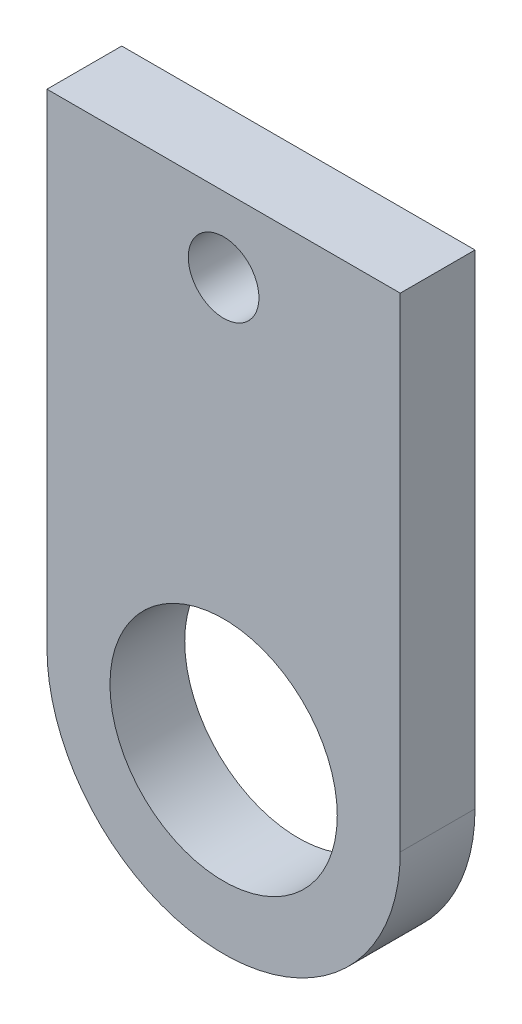
ISO-10303-21;
HEADER;
FILE_DESCRIPTION(('STEP AP214'),'2;1');
FILE_NAME('part.step','',(''),(''),'','','');
FILE_SCHEMA(('AUTOMOTIVE_DESIGN { 1 0 10303 214 1 1 1 1 }'));
ENDSEC;
DATA;
#1=APPLICATION_CONTEXT('core data for automotive mechanical design processes');
#2=APPLICATION_PROTOCOL_DEFINITION('international standard','automotive_design',2000,#1);
#3=PRODUCT_CONTEXT('',#1,'mechanical');
#4=PRODUCT('Part','Part','',(#3));
#5=PRODUCT_RELATED_PRODUCT_CATEGORY('part','',(#4));
#6=PRODUCT_DEFINITION_FORMATION('','',#4);
#7=PRODUCT_DEFINITION_CONTEXT('part definition',#1,'design');
#8=PRODUCT_DEFINITION('design','',#6,#7);
#9=PRODUCT_DEFINITION_SHAPE('','',#8);
#10=(LENGTH_UNIT() NAMED_UNIT(*) SI_UNIT(.MILLI.,.METRE.));
#11=(NAMED_UNIT(*) PLANE_ANGLE_UNIT() SI_UNIT($,.RADIAN.));
#12=(NAMED_UNIT(*) SI_UNIT($,.STERADIAN.) SOLID_ANGLE_UNIT());
#13=UNCERTAINTY_MEASURE_WITH_UNIT(LENGTH_MEASURE(1.E-05),#10,'distance_accuracy_value','');
#14=(GEOMETRIC_REPRESENTATION_CONTEXT(3) GLOBAL_UNCERTAINTY_ASSIGNED_CONTEXT((#13)) GLOBAL_UNIT_ASSIGNED_CONTEXT((#10,
#11,#12)) REPRESENTATION_CONTEXT('',''));
#15=CARTESIAN_POINT('',(0.,0.,0.));
#16=DIRECTION('',(0.,0.,1.));
#17=DIRECTION('',(1.,0.,0.));
#18=AXIS2_PLACEMENT_3D('',#15,#16,#17);
#19=CARTESIAN_POINT('',(-61.8354664257483,6.61926757469637,3.175));
#20=DIRECTION('',(0.,0.,1.));
#21=DIRECTION('',(1.,0.,0.));
#22=AXIS2_PLACEMENT_3D('',#19,#20,#21);
#23=PLANE('',#22);
#24=CARTESIAN_POINT('',(-61.8354664257483,6.61926757469637,3.175));
#25=DIRECTION('',(0.,0.,1.));
#26=DIRECTION('',(1.,0.,0.));
#27=AXIS2_PLACEMENT_3D('',#24,#25,#26);
#28=CIRCLE('',#27,4.826);
#29=CARTESIAN_POINT('',(-57.0094664257483,6.61926757469637,3.175));
#30=VERTEX_POINT('',#29);
#31=EDGE_CURVE('E100',#30,#30,#28,.T.);
#32=ORIENTED_EDGE('',*,*,#31,.F.);
#33=EDGE_LOOP('',(#32));
#34=FACE_BOUND('',#33,.T.);
#35=DIRECTION('',(0.,-1.,0.));
#36=VECTOR('',#35,1.);
#37=CARTESIAN_POINT('',(-69.3354664257483,27.1692675746964,3.175));
#38=LINE('',#37,#36);
#39=CARTESIAN_POINT('',(-69.3354664257483,27.1692675746964,3.175));
#40=VERTEX_POINT('',#39);
#41=CARTESIAN_POINT('',(-69.3354664257483,6.61926757469637,3.175));
#42=VERTEX_POINT('',#41);
#43=EDGE_CURVE('E85',#40,#42,#38,.T.);
#44=ORIENTED_EDGE('',*,*,#43,.T.);
#45=CARTESIAN_POINT('',(-61.8354664257483,6.61926757469637,3.175));
#46=DIRECTION('',(0.,0.,1.));
#47=DIRECTION('',(1.,0.,0.));
#48=AXIS2_PLACEMENT_3D('',#45,#46,#47);
#49=CIRCLE('',#48,7.5);
#50=CARTESIAN_POINT('',(-54.3354664257483,6.61926757469637,3.175));
#51=VERTEX_POINT('',#50);
#52=EDGE_CURVE('E80',#42,#51,#49,.T.);
#53=ORIENTED_EDGE('',*,*,#52,.T.);
#54=DIRECTION('',(0.,1.,0.));
#55=VECTOR('',#54,1.);
#56=CARTESIAN_POINT('',(-54.3354664257483,27.1692675746964,3.175));
#57=LINE('',#56,#55);
#58=CARTESIAN_POINT('',(-54.3354664257483,27.1692675746964,3.175));
#59=VERTEX_POINT('',#58);
#60=EDGE_CURVE('E83',#51,#59,#57,.T.);
#61=ORIENTED_EDGE('',*,*,#60,.T.);
#62=DIRECTION('',(-1.,0.,0.));
#63=VECTOR('',#62,1.);
#64=CARTESIAN_POINT('',(-69.3354664257483,27.1692675746964,3.175));
#65=LINE('',#64,#63);
#66=EDGE_CURVE('E50',#59,#40,#65,.T.);
#67=ORIENTED_EDGE('',*,*,#66,.T.);
#68=EDGE_LOOP('',(#44,#53,#61,#67));
#69=FACE_BOUND('',#68,.T.);
#70=CARTESIAN_POINT('',(-61.8354664257483,23.9942675746964,3.175));
#71=DIRECTION('',(0.,0.,1.));
#72=DIRECTION('',(1.,0.,0.));
#73=AXIS2_PLACEMENT_3D('',#70,#71,#72);
#74=CIRCLE('',#73,1.5);
#75=CARTESIAN_POINT('',(-60.3354664257483,23.9942675746964,3.175));
#76=VERTEX_POINT('',#75);
#77=EDGE_CURVE('E115',#76,#76,#74,.T.);
#78=ORIENTED_EDGE('',*,*,#77,.F.);
#79=EDGE_LOOP('',(#78));
#80=FACE_BOUND('',#79,.T.);
#81=ADVANCED_FACE('F33',(#34,#69,#80),#23,.T.);
#82=CARTESIAN_POINT('',(-61.8354664257483,6.61926757469637,0.));
#83=DIRECTION('',(0.,0.,1.));
#84=DIRECTION('',(1.,0.,0.));
#85=AXIS2_PLACEMENT_3D('',#82,#83,#84);
#86=PLANE('',#85);
#87=DIRECTION('',(0.,-1.,0.));
#88=VECTOR('',#87,1.);
#89=CARTESIAN_POINT('',(-69.3354664257483,27.1692675746964,0.));
#90=LINE('',#89,#88);
#91=CARTESIAN_POINT('',(-69.3354664257483,27.1692675746964,0.));
#92=VERTEX_POINT('',#91);
#93=CARTESIAN_POINT('',(-69.3354664257483,6.61926757469637,0.));
#94=VERTEX_POINT('',#93);
#95=EDGE_CURVE('E97',#92,#94,#90,.T.);
#96=ORIENTED_EDGE('',*,*,#95,.F.);
#97=DIRECTION('',(-1.,0.,0.));
#98=VECTOR('',#97,1.);
#99=CARTESIAN_POINT('',(-69.3354664257483,27.1692675746964,0.));
#100=LINE('',#99,#98);
#101=CARTESIAN_POINT('',(-54.3354664257483,27.1692675746964,0.));
#102=VERTEX_POINT('',#101);
#103=EDGE_CURVE('E73',#102,#92,#100,.T.);
#104=ORIENTED_EDGE('',*,*,#103,.F.);
#105=DIRECTION('',(0.,1.,0.));
#106=VECTOR('',#105,1.);
#107=CARTESIAN_POINT('',(-54.3354664257483,27.1692675746964,0.));
#108=LINE('',#107,#106);
#109=CARTESIAN_POINT('',(-54.3354664257483,6.61926757469637,0.));
#110=VERTEX_POINT('',#109);
#111=EDGE_CURVE('E67',#110,#102,#108,.T.);
#112=ORIENTED_EDGE('',*,*,#111,.F.);
#113=CARTESIAN_POINT('',(-61.8354664257483,6.61926757469637,0.));
#114=DIRECTION('',(0.,0.,1.));
#115=DIRECTION('',(1.,0.,0.));
#116=AXIS2_PLACEMENT_3D('',#113,#114,#115);
#117=CIRCLE('',#116,7.5);
#118=EDGE_CURVE('E89',#94,#110,#117,.T.);
#119=ORIENTED_EDGE('',*,*,#118,.F.);
#120=EDGE_LOOP('',(#96,#104,#112,#119));
#121=FACE_BOUND('',#120,.T.);
#122=CARTESIAN_POINT('',(-61.8354664257483,6.61926757469637,0.));
#123=DIRECTION('',(0.,0.,1.));
#124=DIRECTION('',(1.,0.,0.));
#125=AXIS2_PLACEMENT_3D('',#122,#123,#124);
#126=CIRCLE('',#125,4.826);
#127=CARTESIAN_POINT('',(-57.0094664257483,6.61926757469637,0.));
#128=VERTEX_POINT('',#127);
#129=EDGE_CURVE('E112',#128,#128,#126,.T.);
#130=ORIENTED_EDGE('',*,*,#129,.T.);
#131=EDGE_LOOP('',(#130));
#132=FACE_BOUND('',#131,.T.);
#133=CARTESIAN_POINT('',(-61.8354664257483,23.9942675746964,0.));
#134=DIRECTION('',(0.,0.,1.));
#135=DIRECTION('',(1.,0.,0.));
#136=AXIS2_PLACEMENT_3D('',#133,#134,#135);
#137=CIRCLE('',#136,1.5);
#138=CARTESIAN_POINT('',(-60.3354664257483,23.9942675746964,0.));
#139=VERTEX_POINT('',#138);
#140=EDGE_CURVE('E118',#139,#139,#137,.T.);
#141=ORIENTED_EDGE('',*,*,#140,.T.);
#142=EDGE_LOOP('',(#141));
#143=FACE_BOUND('',#142,.T.);
#144=ADVANCED_FACE('F108',(#121,#132,#143),#86,.F.);
#145=CARTESIAN_POINT('',(-69.3354664257483,27.1692675746964,3.175));
#146=DIRECTION('',(1.,0.,0.));
#147=DIRECTION('',(0.,1.,0.));
#148=AXIS2_PLACEMENT_3D('',#145,#146,#147);
#149=PLANE('',#148);
#150=ORIENTED_EDGE('',*,*,#95,.T.);
#151=DIRECTION('',(0.,0.,-1.));
#152=VECTOR('',#151,1.);
#153=CARTESIAN_POINT('',(-69.3354664257483,6.61926757469637,3.175));
#154=LINE('',#153,#152);
#155=EDGE_CURVE('E11',#42,#94,#154,.T.);
#156=ORIENTED_EDGE('',*,*,#155,.F.);
#157=ORIENTED_EDGE('',*,*,#43,.F.);
#158=DIRECTION('',(0.,0.,-1.));
#159=VECTOR('',#158,1.);
#160=CARTESIAN_POINT('',(-69.3354664257483,27.1692675746964,3.175));
#161=LINE('',#160,#159);
#162=EDGE_CURVE('E93',#40,#92,#161,.T.);
#163=ORIENTED_EDGE('',*,*,#162,.T.);
#164=EDGE_LOOP('',(#150,#156,#157,#163));
#165=FACE_BOUND('',#164,.T.);
#166=ADVANCED_FACE('F35',(#165),#149,.F.);
#167=CARTESIAN_POINT('',(-61.8354664257483,6.61926757469637,3.175));
#168=DIRECTION('',(0.,0.,-1.));
#169=DIRECTION('',(-1.,0.,0.));
#170=AXIS2_PLACEMENT_3D('',#167,#168,#169);
#171=CYLINDRICAL_SURFACE('',#170,7.5);
#172=ORIENTED_EDGE('',*,*,#118,.T.);
#173=DIRECTION('',(0.,0.,-1.));
#174=VECTOR('',#173,1.);
#175=CARTESIAN_POINT('',(-54.3354664257483,6.61926757469637,3.175));
#176=LINE('',#175,#174);
#177=EDGE_CURVE('E42',#51,#110,#176,.T.);
#178=ORIENTED_EDGE('',*,*,#177,.F.);
#179=ORIENTED_EDGE('',*,*,#52,.F.);
#180=ORIENTED_EDGE('',*,*,#155,.T.);
#181=EDGE_LOOP('',(#172,#178,#179,#180));
#182=FACE_BOUND('',#181,.T.);
#183=ADVANCED_FACE('F88',(#182),#171,.T.);
#184=CARTESIAN_POINT('',(-54.3354664257483,27.1692675746964,3.175));
#185=DIRECTION('',(-1.,0.,0.));
#186=DIRECTION('',(0.,-1.,0.));
#187=AXIS2_PLACEMENT_3D('',#184,#185,#186);
#188=PLANE('',#187);
#189=ORIENTED_EDGE('',*,*,#111,.T.);
#190=DIRECTION('',(0.,0.,-1.));
#191=VECTOR('',#190,1.);
#192=CARTESIAN_POINT('',(-54.3354664257483,27.1692675746964,3.175));
#193=LINE('',#192,#191);
#194=EDGE_CURVE('E90',#59,#102,#193,.T.);
#195=ORIENTED_EDGE('',*,*,#194,.F.);
#196=ORIENTED_EDGE('',*,*,#60,.F.);
#197=ORIENTED_EDGE('',*,*,#177,.T.);
#198=EDGE_LOOP('',(#189,#195,#196,#197));
#199=FACE_BOUND('',#198,.T.);
#200=ADVANCED_FACE('F91',(#199),#188,.F.);
#201=CARTESIAN_POINT('',(-69.3354664257483,27.1692675746964,3.175));
#202=DIRECTION('',(0.,-1.,0.));
#203=DIRECTION('',(0.,0.,-1.));
#204=AXIS2_PLACEMENT_3D('',#201,#202,#203);
#205=PLANE('',#204);
#206=ORIENTED_EDGE('',*,*,#103,.T.);
#207=ORIENTED_EDGE('',*,*,#162,.F.);
#208=ORIENTED_EDGE('',*,*,#66,.F.);
#209=ORIENTED_EDGE('',*,*,#194,.T.);
#210=EDGE_LOOP('',(#206,#207,#208,#209));
#211=FACE_BOUND('',#210,.T.);
#212=ADVANCED_FACE('F105',(#211),#205,.F.);
#213=CARTESIAN_POINT('',(-61.8354664257483,6.61926757469637,3.175));
#214=DIRECTION('',(0.,0.,-1.));
#215=DIRECTION('',(-1.,0.,0.));
#216=AXIS2_PLACEMENT_3D('',#213,#214,#215);
#217=CYLINDRICAL_SURFACE('',#216,4.826);
#218=ORIENTED_EDGE('',*,*,#31,.T.);
#219=EDGE_LOOP('',(#218));
#220=FACE_BOUND('',#219,.T.);
#221=ORIENTED_EDGE('',*,*,#129,.F.);
#222=EDGE_LOOP('',(#221));
#223=FACE_BOUND('',#222,.T.);
#224=ADVANCED_FACE('F135',(#220,#223),#217,.F.);
#225=CARTESIAN_POINT('',(-61.8354664257483,23.9942675746964,3.175));
#226=DIRECTION('',(0.,0.,-1.));
#227=DIRECTION('',(-1.,0.,0.));
#228=AXIS2_PLACEMENT_3D('',#225,#226,#227);
#229=CYLINDRICAL_SURFACE('',#228,1.5);
#230=ORIENTED_EDGE('',*,*,#77,.T.);
#231=EDGE_LOOP('',(#230));
#232=FACE_BOUND('',#231,.T.);
#233=ORIENTED_EDGE('',*,*,#140,.F.);
#234=EDGE_LOOP('',(#233));
#235=FACE_BOUND('',#234,.T.);
#236=ADVANCED_FACE('F124',(#232,#235),#229,.F.);
#237=CLOSED_SHELL('',(#81,#144,#166,#183,#200,#212,#224,#236));
#238=MANIFOLD_SOLID_BREP('B2',#237);
#239=ADVANCED_BREP_SHAPE_REPRESENTATION('',(#18,#238),#14);
#240=SHAPE_DEFINITION_REPRESENTATION(#9,#239);
ENDSEC;
END-ISO-10303-21;
